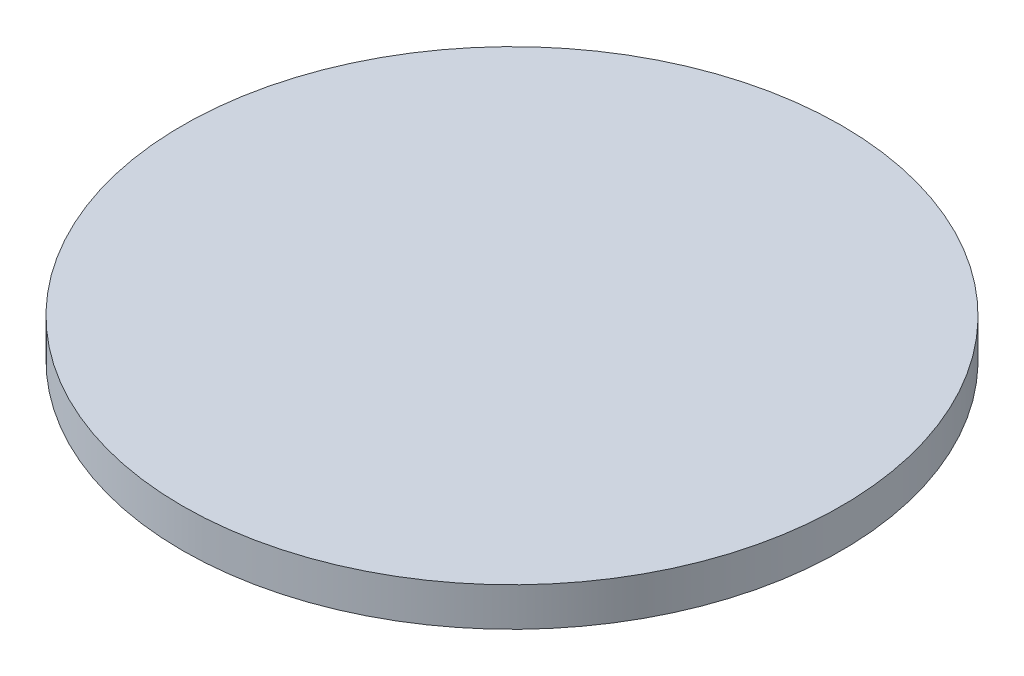
ISO-10303-21;
HEADER;
FILE_DESCRIPTION(('STEP AP214'),'2;1');
FILE_NAME('part.step','',(''),(''),'','','');
FILE_SCHEMA(('AUTOMOTIVE_DESIGN { 1 0 10303 214 1 1 1 1 }'));
ENDSEC;
DATA;
#1=APPLICATION_CONTEXT('core data for automotive mechanical design processes');
#2=APPLICATION_PROTOCOL_DEFINITION('international standard','automotive_design',2000,#1);
#3=PRODUCT_CONTEXT('',#1,'mechanical');
#4=PRODUCT('Part','Part','',(#3));
#5=PRODUCT_RELATED_PRODUCT_CATEGORY('part','',(#4));
#6=PRODUCT_DEFINITION_FORMATION('','',#4);
#7=PRODUCT_DEFINITION_CONTEXT('part definition',#1,'design');
#8=PRODUCT_DEFINITION('design','',#6,#7);
#9=PRODUCT_DEFINITION_SHAPE('','',#8);
#10=(LENGTH_UNIT() NAMED_UNIT(*) SI_UNIT(.MILLI.,.METRE.));
#11=(NAMED_UNIT(*) PLANE_ANGLE_UNIT() SI_UNIT($,.RADIAN.));
#12=(NAMED_UNIT(*) SI_UNIT($,.STERADIAN.) SOLID_ANGLE_UNIT());
#13=UNCERTAINTY_MEASURE_WITH_UNIT(LENGTH_MEASURE(1.E-05),#10,'distance_accuracy_value','');
#14=(GEOMETRIC_REPRESENTATION_CONTEXT(3) GLOBAL_UNCERTAINTY_ASSIGNED_CONTEXT((#13)) GLOBAL_UNIT_ASSIGNED_CONTEXT((#10,
#11,#12)) REPRESENTATION_CONTEXT('',''));
#15=CARTESIAN_POINT('',(0.,0.,0.));
#16=DIRECTION('',(0.,0.,1.));
#17=DIRECTION('',(1.,0.,0.));
#18=AXIS2_PLACEMENT_3D('',#15,#16,#17);
#19=CARTESIAN_POINT('',(0.,1.,0.));
#20=DIRECTION('',(0.,-1.,0.));
#21=DIRECTION('',(0.,0.,-1.));
#22=AXIS2_PLACEMENT_3D('',#19,#20,#21);
#23=CYLINDRICAL_SURFACE('',#22,8.54);
#24=CARTESIAN_POINT('',(0.,1.,0.));
#25=DIRECTION('',(0.,1.,0.));
#26=DIRECTION('',(0.,0.,1.));
#27=AXIS2_PLACEMENT_3D('',#24,#25,#26);
#28=CIRCLE('',#27,8.54);
#29=CARTESIAN_POINT('',(0.,1.,8.54));
#30=VERTEX_POINT('',#29);
#31=EDGE_CURVE('E10',#30,#30,#28,.T.);
#32=ORIENTED_EDGE('',*,*,#31,.F.);
#33=EDGE_LOOP('',(#32));
#34=FACE_BOUND('',#33,.T.);
#35=CARTESIAN_POINT('',(0.,0.,0.));
#36=DIRECTION('',(0.,1.,0.));
#37=DIRECTION('',(0.,0.,1.));
#38=AXIS2_PLACEMENT_3D('',#35,#36,#37);
#39=CIRCLE('',#38,8.54);
#40=CARTESIAN_POINT('',(0.,0.,8.54));
#41=VERTEX_POINT('',#40);
#42=EDGE_CURVE('E44',#41,#41,#39,.T.);
#43=ORIENTED_EDGE('',*,*,#42,.T.);
#44=EDGE_LOOP('',(#43));
#45=FACE_BOUND('',#44,.T.);
#46=ADVANCED_FACE('F41',(#34,#45),#23,.T.);
#47=CARTESIAN_POINT('',(0.,1.,0.));
#48=DIRECTION('',(0.,1.,0.));
#49=DIRECTION('',(0.,0.,1.));
#50=AXIS2_PLACEMENT_3D('',#47,#48,#49);
#51=PLANE('',#50);
#52=ORIENTED_EDGE('',*,*,#31,.T.);
#53=EDGE_LOOP('',(#52));
#54=FACE_BOUND('',#53,.T.);
#55=ADVANCED_FACE('F58',(#54),#51,.T.);
#56=CARTESIAN_POINT('',(0.,0.,0.));
#57=DIRECTION('',(0.,1.,0.));
#58=DIRECTION('',(0.,0.,1.));
#59=AXIS2_PLACEMENT_3D('',#56,#57,#58);
#60=PLANE('',#59);
#61=ORIENTED_EDGE('',*,*,#42,.F.);
#62=EDGE_LOOP('',(#61));
#63=FACE_BOUND('',#62,.T.);
#64=ADVANCED_FACE('F56',(#63),#60,.F.);
#65=CLOSED_SHELL('',(#46,#55,#64));
#66=MANIFOLD_SOLID_BREP('B2',#65);
#67=ADVANCED_BREP_SHAPE_REPRESENTATION('',(#18,#66),#14);
#68=SHAPE_DEFINITION_REPRESENTATION(#9,#67);
ENDSEC;
END-ISO-10303-21;
